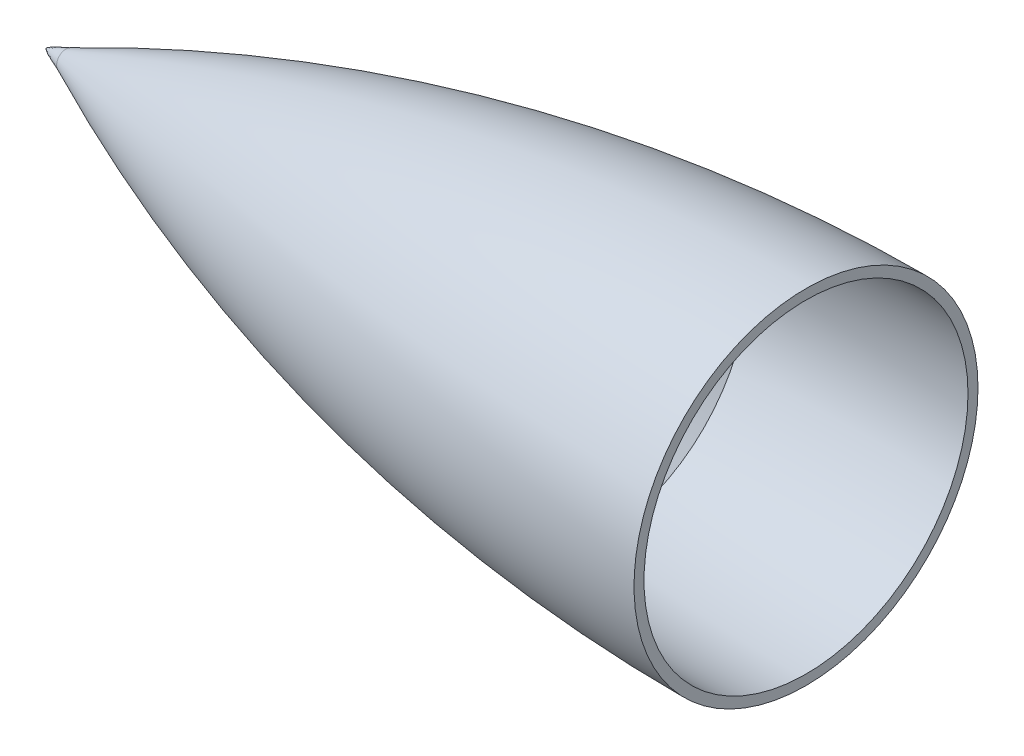
ISO-10303-21;
HEADER;
FILE_DESCRIPTION(('STEP AP214'),'2;1');
FILE_NAME('part.step','',(''),(''),'','','');
FILE_SCHEMA(('AUTOMOTIVE_DESIGN { 1 0 10303 214 1 1 1 1 }'));
ENDSEC;
DATA;
#1=APPLICATION_CONTEXT('core data for automotive mechanical design processes');
#2=APPLICATION_PROTOCOL_DEFINITION('international standard','automotive_design',2000,#1);
#3=PRODUCT_CONTEXT('',#1,'mechanical');
#4=PRODUCT('Part','Part','',(#3));
#5=PRODUCT_RELATED_PRODUCT_CATEGORY('part','',(#4));
#6=PRODUCT_DEFINITION_FORMATION('','',#4);
#7=PRODUCT_DEFINITION_CONTEXT('part definition',#1,'design');
#8=PRODUCT_DEFINITION('design','',#6,#7);
#9=PRODUCT_DEFINITION_SHAPE('','',#8);
#10=(LENGTH_UNIT() NAMED_UNIT(*) SI_UNIT(.MILLI.,.METRE.));
#11=(NAMED_UNIT(*) PLANE_ANGLE_UNIT() SI_UNIT($,.RADIAN.));
#12=(NAMED_UNIT(*) SI_UNIT($,.STERADIAN.) SOLID_ANGLE_UNIT());
#13=UNCERTAINTY_MEASURE_WITH_UNIT(LENGTH_MEASURE(1.E-05),#10,'distance_accuracy_value','');
#14=(GEOMETRIC_REPRESENTATION_CONTEXT(3) GLOBAL_UNCERTAINTY_ASSIGNED_CONTEXT((#13)) GLOBAL_UNIT_ASSIGNED_CONTEXT((#10,
#11,#12)) REPRESENTATION_CONTEXT('',''));
#15=CARTESIAN_POINT('',(0.,0.,0.));
#16=DIRECTION('',(0.,0.,1.));
#17=DIRECTION('',(1.,0.,0.));
#18=AXIS2_PLACEMENT_3D('',#15,#16,#17);
#19=CARTESIAN_POINT('',(0.,398.267441860465,0.));
#20=DIRECTION('',(1.,0.,0.));
#21=DIRECTION('',(0.,0.,-1.));
#22=AXIS2_PLACEMENT_3D('',#19,#20,#21);
#23=DEGENERATE_TOROIDAL_SURFACE('',#22,398.267441860465,441.267441860465,.F.);
#24=CARTESIAN_POINT('',(0.,398.267441860465,0.));
#25=DIRECTION('',(1.,0.,0.));
#26=DIRECTION('',(0.,0.,-1.));
#27=AXIS2_PLACEMENT_3D('',#24,#25,#26);
#28=CIRCLE('',#27,43.);
#29=CARTESIAN_POINT('',(0.,398.267441860465,-43.));
#30=VERTEX_POINT('',#29);
#31=EDGE_CURVE('E63',#30,#30,#28,.T.);
#32=ORIENTED_EDGE('',*,*,#31,.F.);
#33=EDGE_LOOP('',(#32));
#34=FACE_BOUND('',#33,.T.);
#35=CARTESIAN_POINT('',(-185.,398.267441860465,0.));
#36=DIRECTION('',(-1.,0.,0.));
#37=DIRECTION('',(0.,-1.,0.));
#38=AXIS2_PLACEMENT_3D('',#35,#36,#37);
#39=CIRCLE('',#38,2.34703022720045);
#40=CARTESIAN_POINT('',(-185.,395.920411633264,0.));
#41=VERTEX_POINT('',#40);
#42=EDGE_CURVE('E61',#41,#41,#39,.T.);
#43=ORIENTED_EDGE('',*,*,#42,.F.);
#44=EDGE_LOOP('',(#43));
#45=FACE_BOUND('',#44,.T.);
#46=ADVANCED_FACE('F41',(#34,#45),#23,.F.);
#47=CARTESIAN_POINT('',(0.,398.267441860465,398.267441860465));
#48=DIRECTION('',(0.,-1.,0.));
#49=DIRECTION('',(0.,0.,-1.));
#50=AXIS2_PLACEMENT_3D('',#47,#48,#49);
#51=CIRCLE('',#50,436.267441860465);
#52=TRIMMED_CURVE('',#51,(PARAMETER_VALUE(-0.420469330632792)),
(PARAMETER_VALUE(0.420469330632792)),.T.,.PARAMETER.);
#53=CARTESIAN_POINT('',(0.,398.267441860465,0.));
#54=DIRECTION('',(1.,0.,0.));
#55=AXIS1_PLACEMENT('',#53,#54);
#56=SURFACE_OF_REVOLUTION('',#52,#55);
#57=CARTESIAN_POINT('',(-54.8722186320111,398.267441860465,0.));
#58=DIRECTION('',(1.,0.,0.));
#59=DIRECTION('',(0.,0.,-1.));
#60=AXIS2_PLACEMENT_3D('',#57,#58,#59);
#61=CIRCLE('',#60,34.5354237144697);
#62=CARTESIAN_POINT('',(-54.8722186320111,398.267441860465,-34.5354237144697));
#63=VERTEX_POINT('',#62);
#64=EDGE_CURVE('E11',#63,#63,#61,.T.);
#65=ORIENTED_EDGE('',*,*,#64,.T.);
#66=EDGE_LOOP('',(#65));
#67=FACE_BOUND('',#66,.T.);
#68=CARTESIAN_POINT('',(-178.079548464711,398.267441860465,0.));
#69=VERTEX_POINT('',#68);
#70=VERTEX_LOOP('',#69);
#71=FACE_BOUND('',#70,.T.);
#72=ADVANCED_FACE('F90',(#67,#71),#56,.F.);
#73=CARTESIAN_POINT('',(-54.8722186320111,398.267441860465,0.));
#74=DIRECTION('',(1.,0.,0.));
#75=DIRECTION('',(0.,0.,-1.));
#76=AXIS2_PLACEMENT_3D('',#73,#74,#75);
#77=CONICAL_SURFACE('',#76,34.5354237144697,0.785398163397477);
#78=CARTESIAN_POINT('',(-51.9998839668982,398.267441860465,0.));
#79=DIRECTION('',(1.,0.,0.));
#80=DIRECTION('',(0.,0.,-1.));
#81=AXIS2_PLACEMENT_3D('',#78,#79,#80);
#82=CIRCLE('',#81,37.4077583795828);
#83=CARTESIAN_POINT('',(-51.9998839668982,398.267441860465,-37.4077583795828));
#84=VERTEX_POINT('',#83);
#85=EDGE_CURVE('E48',#84,#84,#82,.T.);
#86=ORIENTED_EDGE('',*,*,#85,.T.);
#87=EDGE_LOOP('',(#86));
#88=FACE_BOUND('',#87,.T.);
#89=ORIENTED_EDGE('',*,*,#64,.F.);
#90=EDGE_LOOP('',(#89));
#91=FACE_BOUND('',#90,.T.);
#92=ADVANCED_FACE('F77',(#88,#91),#77,.F.);
#93=CARTESIAN_POINT('',(0.,398.267441860465,0.));
#94=DIRECTION('',(1.,0.,0.));
#95=DIRECTION('',(0.,0.,-1.));
#96=AXIS2_PLACEMENT_3D('',#93,#94,#95);
#97=DEGENERATE_TOROIDAL_SURFACE('',#96,398.267441860465,438.767441860465,.F.);
#98=CARTESIAN_POINT('',(0.,398.267441860465,0.));
#99=DIRECTION('',(1.,0.,0.));
#100=DIRECTION('',(0.,0.,-1.));
#101=AXIS2_PLACEMENT_3D('',#98,#99,#100);
#102=CIRCLE('',#101,40.5);
#103=CARTESIAN_POINT('',(0.,398.267441860465,-40.5));
#104=VERTEX_POINT('',#103);
#105=EDGE_CURVE('E66',#104,#104,#102,.T.);
#106=ORIENTED_EDGE('',*,*,#105,.T.);
#107=EDGE_LOOP('',(#106));
#108=FACE_BOUND('',#107,.T.);
#109=ORIENTED_EDGE('',*,*,#85,.F.);
#110=EDGE_LOOP('',(#109));
#111=FACE_BOUND('',#110,.T.);
#112=ADVANCED_FACE('F80',(#108,#111),#97,.T.);
#113=CARTESIAN_POINT('',(0.,441.267441860465,0.));
#114=DIRECTION('',(1.,0.,0.));
#115=DIRECTION('',(0.,0.,-1.));
#116=AXIS2_PLACEMENT_3D('',#113,#114,#115);
#117=PLANE('',#116);
#118=ORIENTED_EDGE('',*,*,#31,.T.);
#119=EDGE_LOOP('',(#118));
#120=FACE_BOUND('',#119,.T.);
#121=ORIENTED_EDGE('',*,*,#105,.F.);
#122=EDGE_LOOP('',(#121));
#123=FACE_BOUND('',#122,.T.);
#124=ADVANCED_FACE('F57',(#120,#123),#117,.T.);
#125=CARTESIAN_POINT('',(-185.,400.614472087665,0.));
#126=CARTESIAN_POINT('',(-186.994315070824,399.772437375157,0.));
#127=CARTESIAN_POINT('',(-189.334509224748,399.05906875814,0.));
#128=CARTESIAN_POINT('',(-189.991001922598,398.267441860465,0.));
#129=B_SPLINE_CURVE_WITH_KNOTS('',3,(#125,#126,#127,#128),.UNSPECIFIED.,.F.,.F.,(4,4),(0.,1.),.UNSPECIFIED.);
#130=CARTESIAN_POINT('',(-185.,398.267441860465,0.));
#131=DIRECTION('',(1.,0.,0.));
#132=AXIS1_PLACEMENT('',#130,#131);
#133=SURFACE_OF_REVOLUTION('',#129,#132);
#134=CARTESIAN_POINT('',(-189.991001922598,398.267441860465,0.));
#135=VERTEX_POINT('',#134);
#136=VERTEX_LOOP('',#135);
#137=FACE_BOUND('',#136,.T.);
#138=ORIENTED_EDGE('',*,*,#42,.T.);
#139=EDGE_LOOP('',(#138));
#140=FACE_BOUND('',#139,.T.);
#141=ADVANCED_FACE('F54',(#137,#140),#133,.F.);
#142=CLOSED_SHELL('',(#46,#72,#92,#112,#124,#141));
#143=MANIFOLD_SOLID_BREP('B2',#142);
#144=ADVANCED_BREP_SHAPE_REPRESENTATION('',(#18,#143),#14);
#145=SHAPE_DEFINITION_REPRESENTATION(#9,#144);
ENDSEC;
END-ISO-10303-21;
